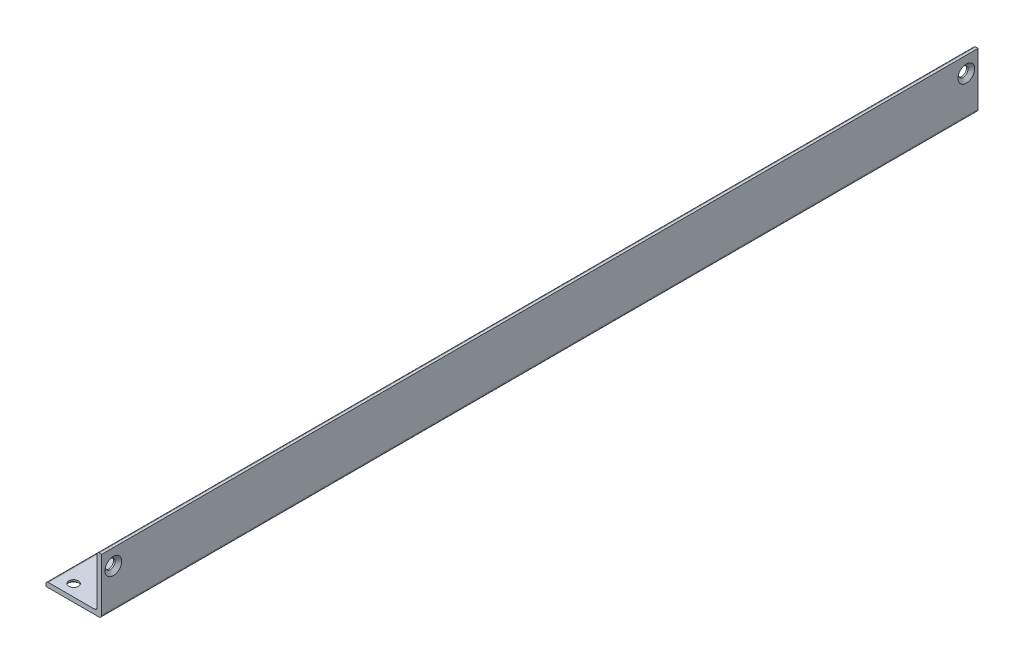
ISO-10303-21;
HEADER;
FILE_DESCRIPTION(('STEP AP214'),'2;1');
FILE_NAME('part.step','',(''),(''),'','','');
FILE_SCHEMA(('AUTOMOTIVE_DESIGN { 1 0 10303 214 1 1 1 1 }'));
ENDSEC;
DATA;
#1=APPLICATION_CONTEXT('core data for automotive mechanical design processes');
#2=APPLICATION_PROTOCOL_DEFINITION('international standard','automotive_design',2000,#1);
#3=PRODUCT_CONTEXT('',#1,'mechanical');
#4=PRODUCT('Part','Part','',(#3));
#5=PRODUCT_RELATED_PRODUCT_CATEGORY('part','',(#4));
#6=PRODUCT_DEFINITION_FORMATION('','',#4);
#7=PRODUCT_DEFINITION_CONTEXT('part definition',#1,'design');
#8=PRODUCT_DEFINITION('design','',#6,#7);
#9=PRODUCT_DEFINITION_SHAPE('','',#8);
#10=(LENGTH_UNIT() NAMED_UNIT(*) SI_UNIT(.MILLI.,.METRE.));
#11=(NAMED_UNIT(*) PLANE_ANGLE_UNIT() SI_UNIT($,.RADIAN.));
#12=(NAMED_UNIT(*) SI_UNIT($,.STERADIAN.) SOLID_ANGLE_UNIT());
#13=UNCERTAINTY_MEASURE_WITH_UNIT(LENGTH_MEASURE(1.E-05),#10,'distance_accuracy_value','');
#14=(GEOMETRIC_REPRESENTATION_CONTEXT(3) GLOBAL_UNCERTAINTY_ASSIGNED_CONTEXT((#13)) GLOBAL_UNIT_ASSIGNED_CONTEXT((#10,
#11,#12)) REPRESENTATION_CONTEXT('',''));
#15=CARTESIAN_POINT('',(0.,0.,0.));
#16=DIRECTION('',(0.,0.,1.));
#17=DIRECTION('',(1.,0.,0.));
#18=AXIS2_PLACEMENT_3D('',#15,#16,#17);
#19=CARTESIAN_POINT('',(-9.525,0.793749999999998,150.));
#20=DIRECTION('',(1.,0.,0.));
#21=DIRECTION('',(0.,0.,-1.));
#22=AXIS2_PLACEMENT_3D('',#19,#20,#21);
#23=PLANE('',#22);
#24=DIRECTION('',(0.,-1.,0.));
#25=VECTOR('',#24,1.);
#26=CARTESIAN_POINT('',(-9.525,0.793749999999998,-150.));
#27=LINE('',#26,#25);
#28=CARTESIAN_POINT('',(-9.525,0.793749999999998,-150.));
#29=VERTEX_POINT('',#28);
#30=CARTESIAN_POINT('',(-9.525,0.,-150.));
#31=VERTEX_POINT('',#30);
#32=EDGE_CURVE('E136',#29,#31,#27,.T.);
#33=ORIENTED_EDGE('',*,*,#32,.T.);
#34=DIRECTION('',(0.,0.,-1.));
#35=VECTOR('',#34,1.);
#36=CARTESIAN_POINT('',(-9.525,0.,150.));
#37=LINE('',#36,#35);
#38=CARTESIAN_POINT('',(-9.525,0.,150.));
#39=VERTEX_POINT('',#38);
#40=EDGE_CURVE('E117',#39,#31,#37,.T.);
#41=ORIENTED_EDGE('',*,*,#40,.F.);
#42=DIRECTION('',(0.,-1.,0.));
#43=VECTOR('',#42,1.);
#44=CARTESIAN_POINT('',(-9.525,0.793749999999998,150.));
#45=LINE('',#44,#43);
#46=CARTESIAN_POINT('',(-9.525,0.793749999999998,150.));
#47=VERTEX_POINT('',#46);
#48=EDGE_CURVE('E123',#47,#39,#45,.T.);
#49=ORIENTED_EDGE('',*,*,#48,.F.);
#50=DIRECTION('',(0.,0.,-1.));
#51=VECTOR('',#50,1.);
#52=CARTESIAN_POINT('',(-9.525,0.793749999999998,150.));
#53=LINE('',#52,#51);
#54=EDGE_CURVE('E226',#47,#29,#53,.T.);
#55=ORIENTED_EDGE('',*,*,#54,.T.);
#56=EDGE_LOOP('',(#33,#41,#49,#55));
#57=FACE_BOUND('',#56,.T.);
#58=ADVANCED_FACE('F39',(#57),#23,.F.);
#59=CARTESIAN_POINT('',(-9.525,0.,150.));
#60=DIRECTION('',(0.,1.,0.));
#61=DIRECTION('',(0.,0.,1.));
#62=AXIS2_PLACEMENT_3D('',#59,#60,#61);
#63=PLANE('',#62);
#64=CARTESIAN_POINT('',(3.49375000000001,0.,129.88));
#65=DIRECTION('',(0.,1.,0.));
#66=DIRECTION('',(0.,0.,1.));
#67=AXIS2_PLACEMENT_3D('',#64,#65,#66);
#68=CIRCLE('',#67,2.0574);
#69=CARTESIAN_POINT('',(3.49375000000001,0.,131.9374));
#70=VERTEX_POINT('',#69);
#71=EDGE_CURVE('E390',#70,#70,#68,.T.);
#72=ORIENTED_EDGE('',*,*,#71,.T.);
#73=EDGE_LOOP('',(#72));
#74=FACE_BOUND('',#73,.T.);
#75=CARTESIAN_POINT('',(3.49374652251576,0.,125.080000000001));
#76=DIRECTION('',(0.,1.,0.));
#77=DIRECTION('',(0.,0.,1.));
#78=AXIS2_PLACEMENT_3D('',#75,#76,#77);
#79=CIRCLE('',#78,2.0574);
#80=CARTESIAN_POINT('',(3.49374652251576,0.,127.137400000001));
#81=VERTEX_POINT('',#80);
#82=EDGE_CURVE('E394',#81,#81,#79,.T.);
#83=ORIENTED_EDGE('',*,*,#82,.T.);
#84=EDGE_LOOP('',(#83));
#85=FACE_BOUND('',#84,.T.);
#86=CARTESIAN_POINT('',(-4.06250000000002,0.,146.));
#87=DIRECTION('',(0.,-1.,0.));
#88=DIRECTION('',(0.,0.,-1.));
#89=AXIS2_PLACEMENT_3D('',#86,#87,#88);
#90=CIRCLE('',#89,2.8575);
#91=CARTESIAN_POINT('',(-4.06250000000002,0.,143.1425));
#92=VERTEX_POINT('',#91);
#93=EDGE_CURVE('E165',#92,#92,#90,.T.);
#94=ORIENTED_EDGE('',*,*,#93,.F.);
#95=EDGE_LOOP('',(#94));
#96=FACE_BOUND('',#95,.T.);
#97=CARTESIAN_POINT('',(-4.06249999999998,0.,-146.));
#98=DIRECTION('',(0.,-1.,0.));
#99=DIRECTION('',(0.,0.,-1.));
#100=AXIS2_PLACEMENT_3D('',#97,#98,#99);
#101=CIRCLE('',#100,2.8575);
#102=CARTESIAN_POINT('',(-4.06249999999998,0.,-148.8575));
#103=VERTEX_POINT('',#102);
#104=EDGE_CURVE('E159',#103,#103,#101,.T.);
#105=ORIENTED_EDGE('',*,*,#104,.F.);
#106=EDGE_LOOP('',(#105));
#107=FACE_BOUND('',#106,.T.);
#108=DIRECTION('',(1.,0.,0.));
#109=VECTOR('',#108,1.);
#110=CARTESIAN_POINT('',(-9.525,0.,-150.));
#111=LINE('',#110,#109);
#112=CARTESIAN_POINT('',(8.525,0.,-150.));
#113=VERTEX_POINT('',#112);
#114=EDGE_CURVE('E229',#31,#113,#111,.T.);
#115=ORIENTED_EDGE('',*,*,#114,.T.);
#116=DIRECTION('',(0.,0.,-1.));
#117=VECTOR('',#116,1.);
#118=CARTESIAN_POINT('',(8.525,0.,150.));
#119=LINE('',#118,#117);
#120=CARTESIAN_POINT('',(8.525,0.,150.));
#121=VERTEX_POINT('',#120);
#122=EDGE_CURVE('E48',#113,#121,#119,.F.);
#123=ORIENTED_EDGE('',*,*,#122,.T.);
#124=DIRECTION('',(1.,0.,0.));
#125=VECTOR('',#124,1.);
#126=CARTESIAN_POINT('',(-9.525,0.,150.));
#127=LINE('',#126,#125);
#128=EDGE_CURVE('E113',#39,#121,#127,.T.);
#129=ORIENTED_EDGE('',*,*,#128,.F.);
#130=ORIENTED_EDGE('',*,*,#40,.T.);
#131=EDGE_LOOP('',(#115,#123,#129,#130));
#132=FACE_BOUND('',#131,.T.);
#133=ADVANCED_FACE('F115',(#74,#85,#96,#107,#132),#63,.F.);
#134=CARTESIAN_POINT('',(9.525,0.,150.));
#135=DIRECTION('',(-1.,0.,0.));
#136=DIRECTION('',(0.,0.,1.));
#137=AXIS2_PLACEMENT_3D('',#134,#135,#136);
#138=PLANE('',#137);
#139=CARTESIAN_POINT('',(9.525,13.5875,146.));
#140=DIRECTION('',(1.,0.,0.));
#141=DIRECTION('',(0.,0.,-1.));
#142=AXIS2_PLACEMENT_3D('',#139,#140,#141);
#143=CIRCLE('',#142,2.8575);
#144=CARTESIAN_POINT('',(9.525,13.5875,143.1425));
#145=VERTEX_POINT('',#144);
#146=EDGE_CURVE('E182',#145,#145,#143,.T.);
#147=ORIENTED_EDGE('',*,*,#146,.F.);
#148=EDGE_LOOP('',(#147));
#149=FACE_BOUND('',#148,.T.);
#150=CARTESIAN_POINT('',(9.525,13.5875,-146.));
#151=DIRECTION('',(1.,0.,0.));
#152=DIRECTION('',(0.,0.,-1.));
#153=AXIS2_PLACEMENT_3D('',#150,#151,#152);
#154=CIRCLE('',#153,2.8575);
#155=CARTESIAN_POINT('',(9.525,13.5875,-148.8575));
#156=VERTEX_POINT('',#155);
#157=EDGE_CURVE('E170',#156,#156,#154,.T.);
#158=ORIENTED_EDGE('',*,*,#157,.F.);
#159=EDGE_LOOP('',(#158));
#160=FACE_BOUND('',#159,.T.);
#161=DIRECTION('',(0.,1.,0.));
#162=VECTOR('',#161,1.);
#163=CARTESIAN_POINT('',(9.525,0.,150.));
#164=LINE('',#163,#162);
#165=CARTESIAN_POINT('',(9.525,1.,150.));
#166=VERTEX_POINT('',#165);
#167=CARTESIAN_POINT('',(9.525,19.05,150.));
#168=VERTEX_POINT('',#167);
#169=EDGE_CURVE('E122',#166,#168,#164,.T.);
#170=ORIENTED_EDGE('',*,*,#169,.F.);
#171=DIRECTION('',(0.,0.,-1.));
#172=VECTOR('',#171,1.);
#173=CARTESIAN_POINT('',(9.525,1.,150.));
#174=LINE('',#173,#172);
#175=CARTESIAN_POINT('',(9.525,1.,-150.));
#176=VERTEX_POINT('',#175);
#177=EDGE_CURVE('E138',#166,#176,#174,.T.);
#178=ORIENTED_EDGE('',*,*,#177,.T.);
#179=DIRECTION('',(0.,1.,0.));
#180=VECTOR('',#179,1.);
#181=CARTESIAN_POINT('',(9.525,0.,-150.));
#182=LINE('',#181,#180);
#183=CARTESIAN_POINT('',(9.525,19.05,-150.));
#184=VERTEX_POINT('',#183);
#185=EDGE_CURVE('E232',#176,#184,#182,.T.);
#186=ORIENTED_EDGE('',*,*,#185,.T.);
#187=DIRECTION('',(0.,0.,-1.));
#188=VECTOR('',#187,1.);
#189=CARTESIAN_POINT('',(9.525,19.05,150.));
#190=LINE('',#189,#188);
#191=EDGE_CURVE('E139',#168,#184,#190,.T.);
#192=ORIENTED_EDGE('',*,*,#191,.F.);
#193=EDGE_LOOP('',(#170,#178,#186,#192));
#194=FACE_BOUND('',#193,.T.);
#195=ADVANCED_FACE('F298',(#149,#160,#194),#138,.F.);
#196=CARTESIAN_POINT('',(8.73125,19.05,150.));
#197=DIRECTION('',(0.,-1.,0.));
#198=DIRECTION('',(0.,0.,-1.));
#199=AXIS2_PLACEMENT_3D('',#196,#197,#198);
#200=PLANE('',#199);
#201=DIRECTION('',(-1.,0.,0.));
#202=VECTOR('',#201,1.);
#203=CARTESIAN_POINT('',(8.73125,19.05,-150.));
#204=LINE('',#203,#202);
#205=CARTESIAN_POINT('',(8.73125,19.05,-150.));
#206=VERTEX_POINT('',#205);
#207=EDGE_CURVE('E235',#184,#206,#204,.T.);
#208=ORIENTED_EDGE('',*,*,#207,.T.);
#209=DIRECTION('',(0.,0.,-1.));
#210=VECTOR('',#209,1.);
#211=CARTESIAN_POINT('',(8.73125,19.05,150.));
#212=LINE('',#211,#210);
#213=CARTESIAN_POINT('',(8.73125,19.05,150.));
#214=VERTEX_POINT('',#213);
#215=EDGE_CURVE('E146',#214,#206,#212,.T.);
#216=ORIENTED_EDGE('',*,*,#215,.F.);
#217=DIRECTION('',(-1.,0.,0.));
#218=VECTOR('',#217,1.);
#219=CARTESIAN_POINT('',(8.73125,19.05,150.));
#220=LINE('',#219,#218);
#221=EDGE_CURVE('E209',#168,#214,#220,.T.);
#222=ORIENTED_EDGE('',*,*,#221,.F.);
#223=ORIENTED_EDGE('',*,*,#191,.T.);
#224=EDGE_LOOP('',(#208,#216,#222,#223));
#225=FACE_BOUND('',#224,.T.);
#226=ADVANCED_FACE('F296',(#225),#200,.F.);
#227=CARTESIAN_POINT('',(8.73125,18.25625,150.));
#228=DIRECTION('',(0.,0.,-1.));
#229=DIRECTION('',(-1.,0.,0.));
#230=AXIS2_PLACEMENT_3D('',#227,#228,#229);
#231=CYLINDRICAL_SURFACE('',#230,0.793749999999999);
#232=CARTESIAN_POINT('',(8.73125,18.25625,-150.));
#233=DIRECTION('',(0.,0.,1.));
#234=DIRECTION('',(-1.,0.,0.));
#235=AXIS2_PLACEMENT_3D('',#232,#233,#234);
#236=CIRCLE('',#235,0.793749999999999);
#237=CARTESIAN_POINT('',(7.9375,18.25625,-150.));
#238=VERTEX_POINT('',#237);
#239=EDGE_CURVE('E238',#206,#238,#236,.T.);
#240=ORIENTED_EDGE('',*,*,#239,.T.);
#241=DIRECTION('',(0.,0.,-1.));
#242=VECTOR('',#241,1.);
#243=CARTESIAN_POINT('',(7.9375,18.25625,150.));
#244=LINE('',#243,#242);
#245=CARTESIAN_POINT('',(7.9375,18.25625,150.));
#246=VERTEX_POINT('',#245);
#247=EDGE_CURVE('E266',#246,#238,#244,.T.);
#248=ORIENTED_EDGE('',*,*,#247,.F.);
#249=CARTESIAN_POINT('',(8.73125,18.25625,150.));
#250=DIRECTION('',(0.,0.,1.));
#251=DIRECTION('',(-1.,0.,0.));
#252=AXIS2_PLACEMENT_3D('',#249,#250,#251);
#253=CIRCLE('',#252,0.793749999999999);
#254=EDGE_CURVE('E212',#214,#246,#253,.T.);
#255=ORIENTED_EDGE('',*,*,#254,.F.);
#256=ORIENTED_EDGE('',*,*,#215,.T.);
#257=EDGE_LOOP('',(#240,#248,#255,#256));
#258=FACE_BOUND('',#257,.T.);
#259=ADVANCED_FACE('F275',(#258),#231,.T.);
#260=CARTESIAN_POINT('',(7.9375,18.25625,150.));
#261=DIRECTION('',(1.,0.,0.));
#262=DIRECTION('',(0.,1.,0.));
#263=AXIS2_PLACEMENT_3D('',#260,#261,#262);
#264=PLANE('',#263);
#265=CARTESIAN_POINT('',(7.93750000000001,13.5875,146.));
#266=DIRECTION('',(1.,0.,0.));
#267=DIRECTION('',(0.,1.,0.));
#268=AXIS2_PLACEMENT_3D('',#265,#266,#267);
#269=CIRCLE('',#268,1.63195);
#270=CARTESIAN_POINT('',(7.93750000000001,15.21945,146.));
#271=VERTEX_POINT('',#270);
#272=EDGE_CURVE('E167',#271,#271,#269,.T.);
#273=ORIENTED_EDGE('',*,*,#272,.T.);
#274=EDGE_LOOP('',(#273));
#275=FACE_BOUND('',#274,.T.);
#276=CARTESIAN_POINT('',(7.93750000000001,13.5875,-146.));
#277=DIRECTION('',(1.,0.,0.));
#278=DIRECTION('',(0.,1.,0.));
#279=AXIS2_PLACEMENT_3D('',#276,#277,#278);
#280=CIRCLE('',#279,1.63195);
#281=CARTESIAN_POINT('',(7.93750000000001,15.21945,-146.));
#282=VERTEX_POINT('',#281);
#283=EDGE_CURVE('E161',#282,#282,#280,.T.);
#284=ORIENTED_EDGE('',*,*,#283,.T.);
#285=EDGE_LOOP('',(#284));
#286=FACE_BOUND('',#285,.T.);
#287=DIRECTION('',(0.,-1.,0.));
#288=VECTOR('',#287,1.);
#289=CARTESIAN_POINT('',(7.9375,18.25625,-150.));
#290=LINE('',#289,#288);
#291=CARTESIAN_POINT('',(7.93750000000001,2.38125,-150.));
#292=VERTEX_POINT('',#291);
#293=EDGE_CURVE('E241',#238,#292,#290,.T.);
#294=ORIENTED_EDGE('',*,*,#293,.T.);
#295=DIRECTION('',(0.,0.,-1.));
#296=VECTOR('',#295,1.);
#297=CARTESIAN_POINT('',(7.93750000000001,2.38125,150.));
#298=LINE('',#297,#296);
#299=CARTESIAN_POINT('',(7.93750000000001,2.38125,150.));
#300=VERTEX_POINT('',#299);
#301=EDGE_CURVE('E262',#300,#292,#298,.T.);
#302=ORIENTED_EDGE('',*,*,#301,.F.);
#303=DIRECTION('',(0.,-1.,0.));
#304=VECTOR('',#303,1.);
#305=CARTESIAN_POINT('',(7.9375,18.25625,150.));
#306=LINE('',#305,#304);
#307=EDGE_CURVE('E215',#246,#300,#306,.T.);
#308=ORIENTED_EDGE('',*,*,#307,.F.);
#309=ORIENTED_EDGE('',*,*,#247,.T.);
#310=EDGE_LOOP('',(#294,#302,#308,#309));
#311=FACE_BOUND('',#310,.T.);
#312=ADVANCED_FACE('F286',(#275,#286,#311),#264,.F.);
#313=CARTESIAN_POINT('',(7.14375000000001,2.38125,150.));
#314=DIRECTION('',(0.,0.,-1.));
#315=DIRECTION('',(-1.,0.,0.));
#316=AXIS2_PLACEMENT_3D('',#313,#314,#315);
#317=CYLINDRICAL_SURFACE('',#316,0.793749999999999);
#318=CARTESIAN_POINT('',(7.14375000000001,2.38125,-150.));
#319=DIRECTION('',(0.,0.,-1.));
#320=DIRECTION('',(-1.,0.,0.));
#321=AXIS2_PLACEMENT_3D('',#318,#319,#320);
#322=CIRCLE('',#321,0.793749999999999);
#323=CARTESIAN_POINT('',(7.14375000000001,1.5875,-150.));
#324=VERTEX_POINT('',#323);
#325=EDGE_CURVE('E244',#292,#324,#322,.T.);
#326=ORIENTED_EDGE('',*,*,#325,.T.);
#327=DIRECTION('',(0.,0.,-1.));
#328=VECTOR('',#327,1.);
#329=CARTESIAN_POINT('',(7.14375000000001,1.5875,150.));
#330=LINE('',#329,#328);
#331=CARTESIAN_POINT('',(7.14375000000001,1.5875,150.));
#332=VERTEX_POINT('',#331);
#333=EDGE_CURVE('E258',#332,#324,#330,.T.);
#334=ORIENTED_EDGE('',*,*,#333,.F.);
#335=CARTESIAN_POINT('',(7.14375000000001,2.38125,150.));
#336=DIRECTION('',(0.,0.,-1.));
#337=DIRECTION('',(-1.,0.,0.));
#338=AXIS2_PLACEMENT_3D('',#335,#336,#337);
#339=CIRCLE('',#338,0.793749999999999);
#340=EDGE_CURVE('E218',#300,#332,#339,.T.);
#341=ORIENTED_EDGE('',*,*,#340,.F.);
#342=ORIENTED_EDGE('',*,*,#301,.T.);
#343=EDGE_LOOP('',(#326,#334,#341,#342));
#344=FACE_BOUND('',#343,.T.);
#345=ADVANCED_FACE('F290',(#344),#317,.F.);
#346=CARTESIAN_POINT('',(7.14375000000001,1.5875,150.));
#347=DIRECTION('',(0.,-1.,0.));
#348=DIRECTION('',(1.,0.,0.));
#349=AXIS2_PLACEMENT_3D('',#346,#347,#348);
#350=PLANE('',#349);
#351=CARTESIAN_POINT('',(3.49375000000001,1.5875,129.88));
#352=DIRECTION('',(0.,1.,0.));
#353=DIRECTION('',(0.,0.,1.));
#354=AXIS2_PLACEMENT_3D('',#351,#352,#353);
#355=CIRCLE('',#354,1.21919999999999);
#356=CARTESIAN_POINT('',(3.49375000000001,1.5875,131.0992));
#357=VERTEX_POINT('',#356);
#358=EDGE_CURVE('E388',#357,#357,#355,.T.);
#359=ORIENTED_EDGE('',*,*,#358,.F.);
#360=EDGE_LOOP('',(#359));
#361=FACE_BOUND('',#360,.T.);
#362=CARTESIAN_POINT('',(3.49374652251576,1.5875,125.080000000001));
#363=DIRECTION('',(0.,1.,0.));
#364=DIRECTION('',(0.,0.,1.));
#365=AXIS2_PLACEMENT_3D('',#362,#363,#364);
#366=CIRCLE('',#365,1.21919999999999);
#367=CARTESIAN_POINT('',(3.49374652251576,1.5875,126.299200000001));
#368=VERTEX_POINT('',#367);
#369=EDGE_CURVE('E402',#368,#368,#366,.T.);
#370=ORIENTED_EDGE('',*,*,#369,.F.);
#371=EDGE_LOOP('',(#370));
#372=FACE_BOUND('',#371,.T.);
#373=CARTESIAN_POINT('',(-4.06250000000002,1.5875,146.));
#374=DIRECTION('',(0.,-1.,0.));
#375=DIRECTION('',(1.,0.,0.));
#376=AXIS2_PLACEMENT_3D('',#373,#374,#375);
#377=CIRCLE('',#376,1.63195);
#378=CARTESIAN_POINT('',(-2.43055000000002,1.5875,146.));
#379=VERTEX_POINT('',#378);
#380=EDGE_CURVE('E155',#379,#379,#377,.T.);
#381=ORIENTED_EDGE('',*,*,#380,.T.);
#382=EDGE_LOOP('',(#381));
#383=FACE_BOUND('',#382,.T.);
#384=CARTESIAN_POINT('',(-4.06249999999998,1.5875,-146.));
#385=DIRECTION('',(0.,-1.,0.));
#386=DIRECTION('',(1.,0.,0.));
#387=AXIS2_PLACEMENT_3D('',#384,#385,#386);
#388=CIRCLE('',#387,1.63195);
#389=CARTESIAN_POINT('',(-2.43054999999999,1.5875,-146.));
#390=VERTEX_POINT('',#389);
#391=EDGE_CURVE('E150',#390,#390,#388,.T.);
#392=ORIENTED_EDGE('',*,*,#391,.T.);
#393=EDGE_LOOP('',(#392));
#394=FACE_BOUND('',#393,.T.);
#395=DIRECTION('',(-1.,0.,0.));
#396=VECTOR('',#395,1.);
#397=CARTESIAN_POINT('',(7.14375000000001,1.5875,-150.));
#398=LINE('',#397,#396);
#399=CARTESIAN_POINT('',(-8.73125,1.5875,-150.));
#400=VERTEX_POINT('',#399);
#401=EDGE_CURVE('E247',#324,#400,#398,.T.);
#402=ORIENTED_EDGE('',*,*,#401,.T.);
#403=DIRECTION('',(0.,0.,-1.));
#404=VECTOR('',#403,1.);
#405=CARTESIAN_POINT('',(-8.73125,1.5875,150.));
#406=LINE('',#405,#404);
#407=CARTESIAN_POINT('',(-8.73125,1.5875,150.));
#408=VERTEX_POINT('',#407);
#409=EDGE_CURVE('E254',#408,#400,#406,.T.);
#410=ORIENTED_EDGE('',*,*,#409,.F.);
#411=DIRECTION('',(-1.,0.,0.));
#412=VECTOR('',#411,1.);
#413=CARTESIAN_POINT('',(7.14375000000001,1.5875,150.));
#414=LINE('',#413,#412);
#415=EDGE_CURVE('E221',#332,#408,#414,.T.);
#416=ORIENTED_EDGE('',*,*,#415,.F.);
#417=ORIENTED_EDGE('',*,*,#333,.T.);
#418=EDGE_LOOP('',(#402,#410,#416,#417));
#419=FACE_BOUND('',#418,.T.);
#420=ADVANCED_FACE('F332',(#361,#372,#383,#394,#419),#350,.F.);
#421=CARTESIAN_POINT('',(-8.73125,0.793749999999998,150.));
#422=DIRECTION('',(0.,0.,-1.));
#423=DIRECTION('',(-1.,0.,0.));
#424=AXIS2_PLACEMENT_3D('',#421,#422,#423);
#425=CYLINDRICAL_SURFACE('',#424,0.793749999999998);
#426=CARTESIAN_POINT('',(-8.73125,0.793749999999998,-150.));
#427=DIRECTION('',(0.,0.,1.));
#428=DIRECTION('',(-1.,0.,0.));
#429=AXIS2_PLACEMENT_3D('',#426,#427,#428);
#430=CIRCLE('',#429,0.793749999999998);
#431=EDGE_CURVE('E133',#400,#29,#430,.T.);
#432=ORIENTED_EDGE('',*,*,#431,.T.);
#433=ORIENTED_EDGE('',*,*,#54,.F.);
#434=CARTESIAN_POINT('',(-8.73125,0.793749999999998,150.));
#435=DIRECTION('',(0.,0.,1.));
#436=DIRECTION('',(-1.,0.,0.));
#437=AXIS2_PLACEMENT_3D('',#434,#435,#436);
#438=CIRCLE('',#437,0.793749999999998);
#439=EDGE_CURVE('E128',#408,#47,#438,.T.);
#440=ORIENTED_EDGE('',*,*,#439,.F.);
#441=ORIENTED_EDGE('',*,*,#409,.T.);
#442=EDGE_LOOP('',(#432,#433,#440,#441));
#443=FACE_BOUND('',#442,.T.);
#444=ADVANCED_FACE('F335',(#443),#425,.T.);
#445=CARTESIAN_POINT('',(8.73125,18.25625,150.));
#446=DIRECTION('',(0.,0.,-1.));
#447=DIRECTION('',(-1.,0.,0.));
#448=AXIS2_PLACEMENT_3D('',#445,#446,#447);
#449=PLANE('',#448);
#450=ORIENTED_EDGE('',*,*,#128,.T.);
#451=CARTESIAN_POINT('',(8.525,1.,150.));
#452=DIRECTION('',(0.,0.,-1.));
#453=DIRECTION('',(-1.,0.,0.));
#454=AXIS2_PLACEMENT_3D('',#451,#452,#453);
#455=CIRCLE('',#454,1.);
#456=EDGE_CURVE('E11',#121,#166,#455,.F.);
#457=ORIENTED_EDGE('',*,*,#456,.T.);
#458=ORIENTED_EDGE('',*,*,#169,.T.);
#459=ORIENTED_EDGE('',*,*,#221,.T.);
#460=ORIENTED_EDGE('',*,*,#254,.T.);
#461=ORIENTED_EDGE('',*,*,#307,.T.);
#462=ORIENTED_EDGE('',*,*,#340,.T.);
#463=ORIENTED_EDGE('',*,*,#415,.T.);
#464=ORIENTED_EDGE('',*,*,#439,.T.);
#465=ORIENTED_EDGE('',*,*,#48,.T.);
#466=EDGE_LOOP('',(#450,#457,#458,#459,#460,#461,#462,#463,#464,#465));
#467=FACE_BOUND('',#466,.T.);
#468=ADVANCED_FACE('F126',(#467),#449,.F.);
#469=CARTESIAN_POINT('',(8.73125,18.25625,-150.));
#470=DIRECTION('',(0.,0.,-1.));
#471=DIRECTION('',(-1.,0.,0.));
#472=AXIS2_PLACEMENT_3D('',#469,#470,#471);
#473=PLANE('',#472);
#474=ORIENTED_EDGE('',*,*,#185,.F.);
#475=CARTESIAN_POINT('',(8.525,1.,-150.));
#476=DIRECTION('',(0.,0.,-1.));
#477=DIRECTION('',(-1.,0.,0.));
#478=AXIS2_PLACEMENT_3D('',#475,#476,#477);
#479=CIRCLE('',#478,1.);
#480=EDGE_CURVE('E62',#176,#113,#479,.T.);
#481=ORIENTED_EDGE('',*,*,#480,.T.);
#482=ORIENTED_EDGE('',*,*,#114,.F.);
#483=ORIENTED_EDGE('',*,*,#32,.F.);
#484=ORIENTED_EDGE('',*,*,#431,.F.);
#485=ORIENTED_EDGE('',*,*,#401,.F.);
#486=ORIENTED_EDGE('',*,*,#325,.F.);
#487=ORIENTED_EDGE('',*,*,#293,.F.);
#488=ORIENTED_EDGE('',*,*,#239,.F.);
#489=ORIENTED_EDGE('',*,*,#207,.F.);
#490=EDGE_LOOP('',(#474,#481,#482,#483,#484,#485,#486,#487,#488,#489));
#491=FACE_BOUND('',#490,.T.);
#492=ADVANCED_FACE('F281',(#491),#473,.T.);
#493=CARTESIAN_POINT('',(-4.06249999999998,0.,-146.));
#494=DIRECTION('',(0.,-1.,0.));
#495=DIRECTION('',(0.,0.,-1.));
#496=AXIS2_PLACEMENT_3D('',#493,#494,#495);
#497=CYLINDRICAL_SURFACE('',#496,1.63195);
#498=CARTESIAN_POINT('',(-4.06249999999998,1.02835855298932,-146.));
#499=DIRECTION('',(0.,-1.,0.));
#500=DIRECTION('',(0.,0.,-1.));
#501=AXIS2_PLACEMENT_3D('',#498,#499,#500);
#502=CIRCLE('',#501,1.63195);
#503=CARTESIAN_POINT('',(-4.06249999999998,1.02835855298932,-147.63195));
#504=VERTEX_POINT('',#503);
#505=EDGE_CURVE('E154',#504,#504,#502,.T.);
#506=ORIENTED_EDGE('',*,*,#505,.T.);
#507=EDGE_LOOP('',(#506));
#508=FACE_BOUND('',#507,.T.);
#509=ORIENTED_EDGE('',*,*,#391,.F.);
#510=EDGE_LOOP('',(#509));
#511=FACE_BOUND('',#510,.T.);
#512=ADVANCED_FACE('F342',(#508,#511),#497,.F.);
#513=CARTESIAN_POINT('',(-4.06249999999998,0.,-146.));
#514=DIRECTION('',(0.,-1.,0.));
#515=DIRECTION('',(0.,0.,-1.));
#516=AXIS2_PLACEMENT_3D('',#513,#514,#515);
#517=CONICAL_SURFACE('',#516,2.8575,0.872664625997165);
#518=ORIENTED_EDGE('',*,*,#505,.F.);
#519=EDGE_LOOP('',(#518));
#520=FACE_BOUND('',#519,.T.);
#521=ORIENTED_EDGE('',*,*,#104,.T.);
#522=EDGE_LOOP('',(#521));
#523=FACE_BOUND('',#522,.T.);
#524=ADVANCED_FACE('F347',(#520,#523),#517,.F.);
#525=CARTESIAN_POINT('',(-4.06250000000002,0.,146.));
#526=DIRECTION('',(0.,-1.,0.));
#527=DIRECTION('',(0.,0.,-1.));
#528=AXIS2_PLACEMENT_3D('',#525,#526,#527);
#529=CYLINDRICAL_SURFACE('',#528,1.63195);
#530=CARTESIAN_POINT('',(-4.06250000000002,1.02835855298932,146.));
#531=DIRECTION('',(0.,-1.,0.));
#532=DIRECTION('',(0.,0.,-1.));
#533=AXIS2_PLACEMENT_3D('',#530,#531,#532);
#534=CIRCLE('',#533,1.63195);
#535=CARTESIAN_POINT('',(-4.06250000000002,1.02835855298932,144.36805));
#536=VERTEX_POINT('',#535);
#537=EDGE_CURVE('E160',#536,#536,#534,.T.);
#538=ORIENTED_EDGE('',*,*,#537,.T.);
#539=EDGE_LOOP('',(#538));
#540=FACE_BOUND('',#539,.T.);
#541=ORIENTED_EDGE('',*,*,#380,.F.);
#542=EDGE_LOOP('',(#541));
#543=FACE_BOUND('',#542,.T.);
#544=ADVANCED_FACE('F351',(#540,#543),#529,.F.);
#545=CARTESIAN_POINT('',(-4.06250000000002,0.,146.));
#546=DIRECTION('',(0.,-1.,0.));
#547=DIRECTION('',(0.,0.,-1.));
#548=AXIS2_PLACEMENT_3D('',#545,#546,#547);
#549=CONICAL_SURFACE('',#548,2.8575,0.872664625997165);
#550=ORIENTED_EDGE('',*,*,#537,.F.);
#551=EDGE_LOOP('',(#550));
#552=FACE_BOUND('',#551,.T.);
#553=ORIENTED_EDGE('',*,*,#93,.T.);
#554=EDGE_LOOP('',(#553));
#555=FACE_BOUND('',#554,.T.);
#556=ADVANCED_FACE('F355',(#552,#555),#549,.F.);
#557=CARTESIAN_POINT('',(9.525,13.5875,-146.));
#558=DIRECTION('',(1.,0.,0.));
#559=DIRECTION('',(0.,0.,-1.));
#560=AXIS2_PLACEMENT_3D('',#557,#558,#559);
#561=CYLINDRICAL_SURFACE('',#560,1.63195);
#562=CARTESIAN_POINT('',(8.49664144701068,13.5875,-146.));
#563=DIRECTION('',(1.,0.,0.));
#564=DIRECTION('',(0.,0.,-1.));
#565=AXIS2_PLACEMENT_3D('',#562,#563,#564);
#566=CIRCLE('',#565,1.63195);
#567=CARTESIAN_POINT('',(8.49664144701068,13.5875,-147.63195));
#568=VERTEX_POINT('',#567);
#569=EDGE_CURVE('E166',#568,#568,#566,.T.);
#570=ORIENTED_EDGE('',*,*,#569,.T.);
#571=EDGE_LOOP('',(#570));
#572=FACE_BOUND('',#571,.T.);
#573=ORIENTED_EDGE('',*,*,#283,.F.);
#574=EDGE_LOOP('',(#573));
#575=FACE_BOUND('',#574,.T.);
#576=ADVANCED_FACE('F359',(#572,#575),#561,.F.);
#577=CARTESIAN_POINT('',(9.525,13.5875,-146.));
#578=DIRECTION('',(1.,0.,0.));
#579=DIRECTION('',(0.,0.,-1.));
#580=AXIS2_PLACEMENT_3D('',#577,#578,#579);
#581=CONICAL_SURFACE('',#580,2.8575,0.872664625997165);
#582=ORIENTED_EDGE('',*,*,#569,.F.);
#583=EDGE_LOOP('',(#582));
#584=FACE_BOUND('',#583,.T.);
#585=ORIENTED_EDGE('',*,*,#157,.T.);
#586=EDGE_LOOP('',(#585));
#587=FACE_BOUND('',#586,.T.);
#588=ADVANCED_FACE('F363',(#584,#587),#581,.F.);
#589=CARTESIAN_POINT('',(9.525,13.5875,146.));
#590=DIRECTION('',(1.,0.,0.));
#591=DIRECTION('',(0.,0.,-1.));
#592=AXIS2_PLACEMENT_3D('',#589,#590,#591);
#593=CYLINDRICAL_SURFACE('',#592,1.63195);
#594=CARTESIAN_POINT('',(8.49664144701068,13.5875,146.));
#595=DIRECTION('',(1.,0.,0.));
#596=DIRECTION('',(0.,0.,-1.));
#597=AXIS2_PLACEMENT_3D('',#594,#595,#596);
#598=CIRCLE('',#597,1.63195);
#599=CARTESIAN_POINT('',(8.49664144701068,13.5875,144.36805));
#600=VERTEX_POINT('',#599);
#601=EDGE_CURVE('E171',#600,#600,#598,.T.);
#602=ORIENTED_EDGE('',*,*,#601,.T.);
#603=EDGE_LOOP('',(#602));
#604=FACE_BOUND('',#603,.T.);
#605=ORIENTED_EDGE('',*,*,#272,.F.);
#606=EDGE_LOOP('',(#605));
#607=FACE_BOUND('',#606,.T.);
#608=ADVANCED_FACE('F311',(#604,#607),#593,.F.);
#609=CARTESIAN_POINT('',(9.525,13.5875,146.));
#610=DIRECTION('',(1.,0.,0.));
#611=DIRECTION('',(0.,0.,-1.));
#612=AXIS2_PLACEMENT_3D('',#609,#610,#611);
#613=CONICAL_SURFACE('',#612,2.8575,0.872664625997165);
#614=ORIENTED_EDGE('',*,*,#601,.F.);
#615=EDGE_LOOP('',(#614));
#616=FACE_BOUND('',#615,.T.);
#617=ORIENTED_EDGE('',*,*,#146,.T.);
#618=EDGE_LOOP('',(#617));
#619=FACE_BOUND('',#618,.T.);
#620=ADVANCED_FACE('F303',(#616,#619),#613,.F.);
#621=CARTESIAN_POINT('',(8.525,1.,150.));
#622=DIRECTION('',(0.,0.,-1.));
#623=DIRECTION('',(-1.,0.,0.));
#624=AXIS2_PLACEMENT_3D('',#621,#622,#623);
#625=CYLINDRICAL_SURFACE('',#624,1.);
#626=ORIENTED_EDGE('',*,*,#456,.F.);
#627=ORIENTED_EDGE('',*,*,#122,.F.);
#628=ORIENTED_EDGE('',*,*,#480,.F.);
#629=ORIENTED_EDGE('',*,*,#177,.F.);
#630=EDGE_LOOP('',(#626,#627,#628,#629));
#631=FACE_BOUND('',#630,.T.);
#632=ADVANCED_FACE('F41',(#631),#625,.T.);
#633=CARTESIAN_POINT('',(3.49374652251576,0.964238798932652,125.080000000001));
#634=DIRECTION('',(0.,-1.,0.));
#635=DIRECTION('',(0.,0.,-1.));
#636=AXIS2_PLACEMENT_3D('',#633,#634,#635);
#637=CONICAL_SURFACE('',#636,1.2192,0.715584993317675);
#638=ORIENTED_EDGE('',*,*,#82,.F.);
#639=EDGE_LOOP('',(#638));
#640=FACE_BOUND('',#639,.T.);
#641=CARTESIAN_POINT('',(3.49374652251576,0.964238798932652,125.080000000001));
#642=DIRECTION('',(0.,1.,0.));
#643=DIRECTION('',(0.,0.,1.));
#644=AXIS2_PLACEMENT_3D('',#641,#642,#643);
#645=CIRCLE('',#644,1.2192);
#646=CARTESIAN_POINT('',(3.49374652251576,0.964238798932652,126.299200000001));
#647=VERTEX_POINT('',#646);
#648=EDGE_CURVE('E188',#647,#647,#645,.T.);
#649=ORIENTED_EDGE('',*,*,#648,.T.);
#650=EDGE_LOOP('',(#649));
#651=FACE_BOUND('',#650,.T.);
#652=ADVANCED_FACE('F302',(#640,#651),#637,.F.);
#653=CARTESIAN_POINT('',(3.49374652251576,1.5875,125.080000000001));
#654=DIRECTION('',(0.,1.,0.));
#655=DIRECTION('',(0.,0.,1.));
#656=AXIS2_PLACEMENT_3D('',#653,#654,#655);
#657=CYLINDRICAL_SURFACE('',#656,1.21919999999999);
#658=ORIENTED_EDGE('',*,*,#648,.F.);
#659=EDGE_LOOP('',(#658));
#660=FACE_BOUND('',#659,.T.);
#661=ORIENTED_EDGE('',*,*,#369,.T.);
#662=EDGE_LOOP('',(#661));
#663=FACE_BOUND('',#662,.T.);
#664=ADVANCED_FACE('F308',(#660,#663),#657,.F.);
#665=CARTESIAN_POINT('',(3.49375000000001,0.964238798932652,129.88));
#666=DIRECTION('',(0.,-1.,0.));
#667=DIRECTION('',(0.,0.,-1.));
#668=AXIS2_PLACEMENT_3D('',#665,#666,#667);
#669=CONICAL_SURFACE('',#668,1.2192,0.715584993317675);
#670=ORIENTED_EDGE('',*,*,#71,.F.);
#671=EDGE_LOOP('',(#670));
#672=FACE_BOUND('',#671,.T.);
#673=CARTESIAN_POINT('',(3.49375000000001,0.964238798932652,129.88));
#674=DIRECTION('',(0.,1.,0.));
#675=DIRECTION('',(0.,0.,1.));
#676=AXIS2_PLACEMENT_3D('',#673,#674,#675);
#677=CIRCLE('',#676,1.2192);
#678=CARTESIAN_POINT('',(3.49375000000001,0.964238798932652,131.0992));
#679=VERTEX_POINT('',#678);
#680=EDGE_CURVE('E385',#679,#679,#677,.T.);
#681=ORIENTED_EDGE('',*,*,#680,.T.);
#682=EDGE_LOOP('',(#681));
#683=FACE_BOUND('',#682,.T.);
#684=ADVANCED_FACE('F372',(#672,#683),#669,.F.);
#685=CARTESIAN_POINT('',(3.49375000000001,1.5875,129.88));
#686=DIRECTION('',(0.,1.,0.));
#687=DIRECTION('',(0.,0.,1.));
#688=AXIS2_PLACEMENT_3D('',#685,#686,#687);
#689=CYLINDRICAL_SURFACE('',#688,1.21919999999999);
#690=ORIENTED_EDGE('',*,*,#680,.F.);
#691=EDGE_LOOP('',(#690));
#692=FACE_BOUND('',#691,.T.);
#693=ORIENTED_EDGE('',*,*,#358,.T.);
#694=EDGE_LOOP('',(#693));
#695=FACE_BOUND('',#694,.T.);
#696=ADVANCED_FACE('F376',(#692,#695),#689,.F.);
#697=CLOSED_SHELL('',(#58,#133,#195,#226,#259,#312,#345,#420,#444,#468,#492,#512,#524,#544,#556,
#576,#588,#608,#620,#632,#652,#664,#684,#696));
#698=MANIFOLD_SOLID_BREP('B2',#697);
#699=ADVANCED_BREP_SHAPE_REPRESENTATION('',(#18,#698),#14);
#700=SHAPE_DEFINITION_REPRESENTATION(#9,#699);
ENDSEC;
END-ISO-10303-21;
